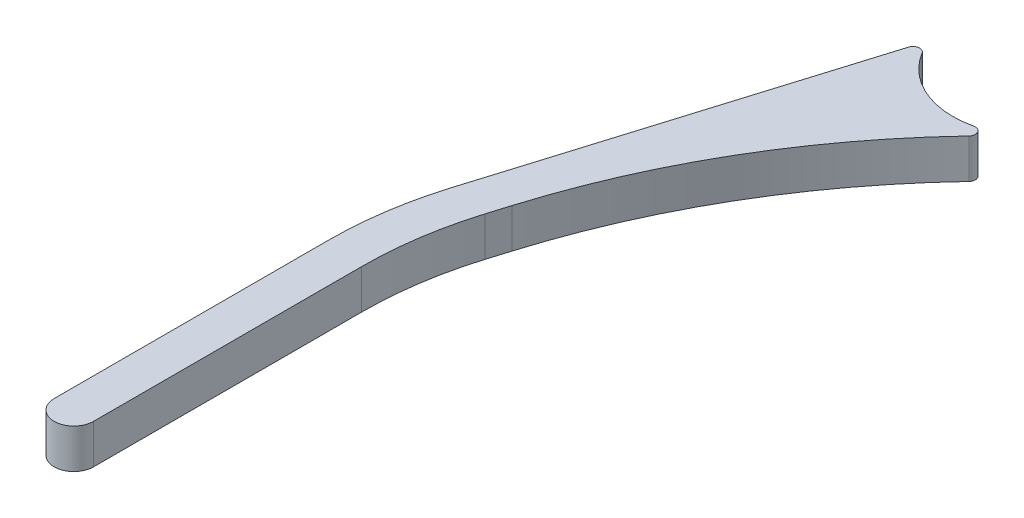
ISO-10303-21;
HEADER;
FILE_DESCRIPTION(('STEP AP214'),'2;1');
FILE_NAME('part.step','',(''),(''),'','','');
FILE_SCHEMA(('AUTOMOTIVE_DESIGN { 1 0 10303 214 1 1 1 1 }'));
ENDSEC;
DATA;
#1=APPLICATION_CONTEXT('core data for automotive mechanical design processes');
#2=APPLICATION_PROTOCOL_DEFINITION('international standard','automotive_design',2000,#1);
#3=PRODUCT_CONTEXT('',#1,'mechanical');
#4=PRODUCT('Part','Part','',(#3));
#5=PRODUCT_RELATED_PRODUCT_CATEGORY('part','',(#4));
#6=PRODUCT_DEFINITION_FORMATION('','',#4);
#7=PRODUCT_DEFINITION_CONTEXT('part definition',#1,'design');
#8=PRODUCT_DEFINITION('design','',#6,#7);
#9=PRODUCT_DEFINITION_SHAPE('','',#8);
#10=(LENGTH_UNIT() NAMED_UNIT(*) SI_UNIT(.MILLI.,.METRE.));
#11=(NAMED_UNIT(*) PLANE_ANGLE_UNIT() SI_UNIT($,.RADIAN.));
#12=(NAMED_UNIT(*) SI_UNIT($,.STERADIAN.) SOLID_ANGLE_UNIT());
#13=UNCERTAINTY_MEASURE_WITH_UNIT(LENGTH_MEASURE(1.E-05),#10,'distance_accuracy_value','');
#14=(GEOMETRIC_REPRESENTATION_CONTEXT(3) GLOBAL_UNCERTAINTY_ASSIGNED_CONTEXT((#13)) GLOBAL_UNIT_ASSIGNED_CONTEXT((#10,
#11,#12)) REPRESENTATION_CONTEXT('',''));
#15=CARTESIAN_POINT('',(0.,0.,0.));
#16=DIRECTION('',(0.,0.,1.));
#17=DIRECTION('',(1.,0.,0.));
#18=AXIS2_PLACEMENT_3D('',#15,#16,#17);
#19=CARTESIAN_POINT('',(-89.4955830872352,19.05,374.65));
#20=DIRECTION('',(0.,-1.,0.));
#21=DIRECTION('',(0.,0.,-1.));
#22=AXIS2_PLACEMENT_3D('',#19,#20,#21);
#23=CYLINDRICAL_SURFACE('',#22,9.52500000000001);
#24=CARTESIAN_POINT('',(-89.4955830872352,0.,374.65));
#25=DIRECTION('',(0.,1.,0.));
#26=DIRECTION('',(0.,0.,-1.));
#27=AXIS2_PLACEMENT_3D('',#24,#25,#26);
#28=CIRCLE('',#27,9.52500000000001);
#29=CARTESIAN_POINT('',(-99.0205830872352,0.,374.65));
#30=VERTEX_POINT('',#29);
#31=CARTESIAN_POINT('',(-79.9705830872352,0.,374.65));
#32=VERTEX_POINT('',#31);
#33=EDGE_CURVE('E149',#30,#32,#28,.T.);
#34=ORIENTED_EDGE('',*,*,#33,.T.);
#35=DIRECTION('',(0.,-1.,0.));
#36=VECTOR('',#35,1.);
#37=CARTESIAN_POINT('',(-79.9705830872352,19.05,374.65));
#38=LINE('',#37,#36);
#39=CARTESIAN_POINT('',(-79.9705830872352,19.05,374.65));
#40=VERTEX_POINT('',#39);
#41=EDGE_CURVE('E11',#40,#32,#38,.T.);
#42=ORIENTED_EDGE('',*,*,#41,.F.);
#43=CARTESIAN_POINT('',(-89.4955830872352,19.05,374.65));
#44=DIRECTION('',(0.,1.,0.));
#45=DIRECTION('',(0.,0.,-1.));
#46=AXIS2_PLACEMENT_3D('',#43,#44,#45);
#47=CIRCLE('',#46,9.52500000000001);
#48=CARTESIAN_POINT('',(-99.0205830872352,19.05,374.65));
#49=VERTEX_POINT('',#48);
#50=EDGE_CURVE('E170',#49,#40,#47,.T.);
#51=ORIENTED_EDGE('',*,*,#50,.F.);
#52=DIRECTION('',(0.,-1.,0.));
#53=VECTOR('',#52,1.);
#54=CARTESIAN_POINT('',(-99.0205830872352,19.05,374.65));
#55=LINE('',#54,#53);
#56=EDGE_CURVE('E145',#49,#30,#55,.T.);
#57=ORIENTED_EDGE('',*,*,#56,.T.);
#58=EDGE_LOOP('',(#34,#42,#51,#57));
#59=FACE_BOUND('',#58,.T.);
#60=ADVANCED_FACE('F32',(#59),#23,.T.);
#61=CARTESIAN_POINT('',(-79.9705830872352,19.05,245.266880287831));
#62=DIRECTION('',(-1.,0.,0.));
#63=DIRECTION('',(0.,0.,1.));
#64=AXIS2_PLACEMENT_3D('',#61,#62,#63);
#65=PLANE('',#64);
#66=DIRECTION('',(0.,0.,-1.));
#67=VECTOR('',#66,1.);
#68=CARTESIAN_POINT('',(-79.9705830872352,0.,245.266880287831));
#69=LINE('',#68,#67);
#70=CARTESIAN_POINT('',(-79.9705830872352,0.,245.266880287831));
#71=VERTEX_POINT('',#70);
#72=EDGE_CURVE('E152',#32,#71,#69,.T.);
#73=ORIENTED_EDGE('',*,*,#72,.T.);
#74=DIRECTION('',(0.,-1.,0.));
#75=VECTOR('',#74,1.);
#76=CARTESIAN_POINT('',(-79.9705830872352,19.05,245.266880287831));
#77=LINE('',#76,#75);
#78=CARTESIAN_POINT('',(-79.9705830872352,19.05,245.266880287831));
#79=VERTEX_POINT('',#78);
#80=EDGE_CURVE('E40',#79,#71,#77,.T.);
#81=ORIENTED_EDGE('',*,*,#80,.F.);
#82=DIRECTION('',(0.,0.,-1.));
#83=VECTOR('',#82,1.);
#84=CARTESIAN_POINT('',(-79.9705830872352,19.05,245.266880287831));
#85=LINE('',#84,#83);
#86=EDGE_CURVE('E101',#40,#79,#85,.T.);
#87=ORIENTED_EDGE('',*,*,#86,.F.);
#88=ORIENTED_EDGE('',*,*,#41,.T.);
#89=EDGE_LOOP('',(#73,#81,#87,#88));
#90=FACE_BOUND('',#89,.T.);
#91=ADVANCED_FACE('F242',(#90),#65,.F.);
#92=CARTESIAN_POINT('',(97.8294169127646,19.05,245.266880287832));
#93=DIRECTION('',(0.,-1.,0.));
#94=DIRECTION('',(0.,0.,-1.));
#95=AXIS2_PLACEMENT_3D('',#92,#93,#94);
#96=CYLINDRICAL_SURFACE('',#95,177.8);
#97=CARTESIAN_POINT('',(97.8294169127646,0.,245.266880287832));
#98=DIRECTION('',(0.,-1.,0.));
#99=DIRECTION('',(0.,0.,1.));
#100=AXIS2_PLACEMENT_3D('',#97,#98,#99);
#101=CIRCLE('',#100,177.8);
#102=CARTESIAN_POINT('',(-72.2428551354819,0.,193.418425341255));
#103=VERTEX_POINT('',#102);
#104=EDGE_CURVE('E155',#71,#103,#101,.T.);
#105=ORIENTED_EDGE('',*,*,#104,.T.);
#106=DIRECTION('',(0.,-1.,0.));
#107=VECTOR('',#106,1.);
#108=CARTESIAN_POINT('',(-72.2428551354819,19.05,193.418425341255));
#109=LINE('',#108,#107);
#110=CARTESIAN_POINT('',(-72.2428551354819,19.05,193.418425341255));
#111=VERTEX_POINT('',#110);
#112=EDGE_CURVE('E186',#111,#103,#109,.T.);
#113=ORIENTED_EDGE('',*,*,#112,.F.);
#114=CARTESIAN_POINT('',(97.8294169127646,19.05,245.266880287832));
#115=DIRECTION('',(0.,-1.,0.));
#116=DIRECTION('',(0.,0.,1.));
#117=AXIS2_PLACEMENT_3D('',#114,#115,#116);
#118=CIRCLE('',#117,177.8);
#119=EDGE_CURVE('E194',#79,#111,#118,.T.);
#120=ORIENTED_EDGE('',*,*,#119,.F.);
#121=ORIENTED_EDGE('',*,*,#80,.T.);
#122=EDGE_LOOP('',(#105,#113,#120,#121));
#123=FACE_BOUND('',#122,.T.);
#124=ADVANCED_FACE('F192',(#123),#96,.F.);
#125=CARTESIAN_POINT('',(-69.161727013274,19.05,183.311770075335));
#126=DIRECTION('',(-0.956536963150994,0.,-0.291611107686032));
#127=DIRECTION('',(-0.291611107686032,0.,0.956536963150994));
#128=AXIS2_PLACEMENT_3D('',#125,#126,#127);
#129=PLANE('',#128);
#130=DIRECTION('',(0.291611107686032,0.,-0.956536963150994));
#131=VECTOR('',#130,1.);
#132=CARTESIAN_POINT('',(-69.161727013274,0.,183.311770075335));
#133=LINE('',#132,#131);
#134=CARTESIAN_POINT('',(-69.161727013274,0.,183.311770075335));
#135=VERTEX_POINT('',#134);
#136=EDGE_CURVE('E157',#103,#135,#133,.T.);
#137=ORIENTED_EDGE('',*,*,#136,.T.);
#138=DIRECTION('',(0.,-1.,0.));
#139=VECTOR('',#138,1.);
#140=CARTESIAN_POINT('',(-69.161727013274,19.05,183.311770075335));
#141=LINE('',#140,#139);
#142=CARTESIAN_POINT('',(-69.161727013274,19.05,183.311770075335));
#143=VERTEX_POINT('',#142);
#144=EDGE_CURVE('E183',#143,#135,#141,.T.);
#145=ORIENTED_EDGE('',*,*,#144,.F.);
#146=DIRECTION('',(0.291611107686032,0.,-0.956536963150994));
#147=VECTOR('',#146,1.);
#148=CARTESIAN_POINT('',(-69.161727013274,19.05,183.311770075335));
#149=LINE('',#148,#147);
#150=EDGE_CURVE('E212',#111,#143,#149,.T.);
#151=ORIENTED_EDGE('',*,*,#150,.F.);
#152=ORIENTED_EDGE('',*,*,#112,.T.);
#153=EDGE_LOOP('',(#137,#145,#151,#152));
#154=FACE_BOUND('',#153,.T.);
#155=ADVANCED_FACE('F203',(#154),#129,.F.);
#156=CARTESIAN_POINT('',(266.906174547564,19.05,285.765869401558));
#157=DIRECTION('',(0.,-1.,0.));
#158=DIRECTION('',(0.,0.,-1.));
#159=AXIS2_PLACEMENT_3D('',#156,#157,#158);
#160=CYLINDRICAL_SURFACE('',#159,351.338123363026);
#161=CARTESIAN_POINT('',(266.906174547564,0.,285.765869401558));
#162=DIRECTION('',(0.,-1.,0.));
#163=DIRECTION('',(0.,0.,-1.));
#164=AXIS2_PLACEMENT_3D('',#161,#162,#163);
#165=CIRCLE('',#164,351.338123363026);
#166=CARTESIAN_POINT('',(12.0504296123994,0.,43.924958466714));
#167=VERTEX_POINT('',#166);
#168=EDGE_CURVE('E159',#135,#167,#165,.T.);
#169=ORIENTED_EDGE('',*,*,#168,.T.);
#170=DIRECTION('',(0.,-1.,0.));
#171=VECTOR('',#170,1.);
#172=CARTESIAN_POINT('',(12.0504296123994,19.05,43.924958466714));
#173=LINE('',#172,#171);
#174=CARTESIAN_POINT('',(12.0504296123994,19.05,43.924958466714));
#175=VERTEX_POINT('',#174);
#176=EDGE_CURVE('E180',#175,#167,#173,.T.);
#177=ORIENTED_EDGE('',*,*,#176,.F.);
#178=CARTESIAN_POINT('',(266.906174547564,19.05,285.765869401558));
#179=DIRECTION('',(0.,-1.,0.));
#180=DIRECTION('',(0.,0.,-1.));
#181=AXIS2_PLACEMENT_3D('',#178,#179,#180);
#182=CIRCLE('',#181,351.338123363026);
#183=EDGE_CURVE('E209',#143,#175,#182,.T.);
#184=ORIENTED_EDGE('',*,*,#183,.F.);
#185=ORIENTED_EDGE('',*,*,#144,.T.);
#186=EDGE_LOOP('',(#169,#177,#184,#185));
#187=FACE_BOUND('',#186,.T.);
#188=ADVANCED_FACE('F207',(#187),#160,.F.);
#189=CARTESIAN_POINT('',(9.74732916197356,19.05,41.7394714923194));
#190=DIRECTION('',(0.,-1.,0.));
#191=DIRECTION('',(0.,0.,-1.));
#192=AXIS2_PLACEMENT_3D('',#189,#190,#191);
#193=CYLINDRICAL_SURFACE('',#192,3.17499999999998);
#194=CARTESIAN_POINT('',(9.74732916197356,0.,41.7394714923194));
#195=DIRECTION('',(0.,1.,0.));
#196=DIRECTION('',(0.,0.,-1.));
#197=AXIS2_PLACEMENT_3D('',#194,#195,#196);
#198=CIRCLE('',#197,3.17499999999998);
#199=CARTESIAN_POINT('',(9.02530477960515,0.,38.6476587891846));
#200=VERTEX_POINT('',#199);
#201=EDGE_CURVE('E161',#167,#200,#198,.T.);
#202=ORIENTED_EDGE('',*,*,#201,.T.);
#203=DIRECTION('',(0.,-1.,0.));
#204=VECTOR('',#203,1.);
#205=CARTESIAN_POINT('',(9.02530477960515,19.05,38.6476587891846));
#206=LINE('',#205,#204);
#207=CARTESIAN_POINT('',(9.02530477960515,19.05,38.6476587891846));
#208=VERTEX_POINT('',#207);
#209=EDGE_CURVE('E177',#208,#200,#206,.T.);
#210=ORIENTED_EDGE('',*,*,#209,.F.);
#211=CARTESIAN_POINT('',(9.74732916197356,19.05,41.7394714923194));
#212=DIRECTION('',(0.,1.,0.));
#213=DIRECTION('',(0.,0.,-1.));
#214=AXIS2_PLACEMENT_3D('',#211,#212,#213);
#215=CIRCLE('',#214,3.17499999999998);
#216=EDGE_CURVE('E211',#175,#208,#215,.T.);
#217=ORIENTED_EDGE('',*,*,#216,.F.);
#218=ORIENTED_EDGE('',*,*,#176,.T.);
#219=EDGE_LOOP('',(#202,#210,#217,#218));
#220=FACE_BOUND('',#219,.T.);
#221=ADVANCED_FACE('F255',(#220),#193,.T.);
#222=CARTESIAN_POINT('',(0.,19.05,0.));
#223=DIRECTION('',(0.,-1.,0.));
#224=DIRECTION('',(0.,0.,-1.));
#225=AXIS2_PLACEMENT_3D('',#222,#223,#224);
#226=CYLINDRICAL_SURFACE('',#225,39.6875);
#227=CARTESIAN_POINT('',(0.,0.,0.));
#228=DIRECTION('',(0.,-1.,0.));
#229=DIRECTION('',(0.,0.,1.));
#230=AXIS2_PLACEMENT_3D('',#227,#228,#229);
#231=CIRCLE('',#230,39.6875);
#232=CARTESIAN_POINT('',(-33.934614128376,0.,20.5800782362028));
#233=VERTEX_POINT('',#232);
#234=EDGE_CURVE('E163',#200,#233,#231,.T.);
#235=ORIENTED_EDGE('',*,*,#234,.T.);
#236=DIRECTION('',(0.,-1.,0.));
#237=VECTOR('',#236,1.);
#238=CARTESIAN_POINT('',(-33.934614128376,19.05,20.5800782362028));
#239=LINE('',#238,#237);
#240=CARTESIAN_POINT('',(-33.934614128376,19.05,20.5800782362028));
#241=VERTEX_POINT('',#240);
#242=EDGE_CURVE('E174',#241,#233,#239,.T.);
#243=ORIENTED_EDGE('',*,*,#242,.F.);
#244=CARTESIAN_POINT('',(0.,19.05,0.));
#245=DIRECTION('',(0.,-1.,0.));
#246=DIRECTION('',(0.,0.,1.));
#247=AXIS2_PLACEMENT_3D('',#244,#245,#246);
#248=CIRCLE('',#247,39.6875);
#249=EDGE_CURVE('E214',#208,#241,#248,.T.);
#250=ORIENTED_EDGE('',*,*,#249,.F.);
#251=ORIENTED_EDGE('',*,*,#209,.T.);
#252=EDGE_LOOP('',(#235,#243,#250,#251));
#253=FACE_BOUND('',#252,.T.);
#254=ADVANCED_FACE('F223',(#253),#226,.F.);
#255=CARTESIAN_POINT('',(-36.649383258646,19.05,22.226484495099));
#256=DIRECTION('',(0.,-1.,0.));
#257=DIRECTION('',(0.,0.,-1.));
#258=AXIS2_PLACEMENT_3D('',#255,#256,#257);
#259=CYLINDRICAL_SURFACE('',#258,3.17499999999999);
#260=CARTESIAN_POINT('',(-36.649383258646,0.,22.226484495099));
#261=DIRECTION('',(0.,1.,0.));
#262=DIRECTION('',(0.,0.,-1.));
#263=AXIS2_PLACEMENT_3D('',#260,#261,#262);
#264=CIRCLE('',#263,3.17499999999999);
#265=CARTESIAN_POINT('',(-39.6863881166504,0.,21.3006192281958));
#266=VERTEX_POINT('',#265);
#267=EDGE_CURVE('E165',#233,#266,#264,.T.);
#268=ORIENTED_EDGE('',*,*,#267,.T.);
#269=DIRECTION('',(0.,-1.,0.));
#270=VECTOR('',#269,1.);
#271=CARTESIAN_POINT('',(-39.6863881166504,19.05,21.3006192281958));
#272=LINE('',#271,#270);
#273=CARTESIAN_POINT('',(-39.6863881166504,19.05,21.3006192281958));
#274=VERTEX_POINT('',#273);
#275=EDGE_CURVE('E140',#274,#266,#272,.T.);
#276=ORIENTED_EDGE('',*,*,#275,.F.);
#277=CARTESIAN_POINT('',(-36.649383258646,19.05,22.226484495099));
#278=DIRECTION('',(0.,1.,0.));
#279=DIRECTION('',(0.,0.,-1.));
#280=AXIS2_PLACEMENT_3D('',#277,#278,#279);
#281=CIRCLE('',#280,3.17499999999999);
#282=EDGE_CURVE('E131',#241,#274,#281,.T.);
#283=ORIENTED_EDGE('',*,*,#282,.F.);
#284=ORIENTED_EDGE('',*,*,#242,.T.);
#285=EDGE_LOOP('',(#268,#276,#283,#284));
#286=FACE_BOUND('',#285,.T.);
#287=ADVANCED_FACE('F227',(#286),#259,.T.);
#288=CARTESIAN_POINT('',(-91.292855135482,19.05,190.579127282469));
#289=DIRECTION('',(0.956536963150994,0.,0.29161110768603));
#290=DIRECTION('',(0.29161110768603,0.,-0.956536963150994));
#291=AXIS2_PLACEMENT_3D('',#288,#289,#290);
#292=PLANE('',#291);
#293=DIRECTION('',(-0.29161110768603,0.,0.956536963150994));
#294=VECTOR('',#293,1.);
#295=CARTESIAN_POINT('',(-91.292855135482,0.,190.579127282469));
#296=LINE('',#295,#294);
#297=CARTESIAN_POINT('',(-91.292855135482,0.,190.579127282469));
#298=VERTEX_POINT('',#297);
#299=EDGE_CURVE('E139',#266,#298,#296,.T.);
#300=ORIENTED_EDGE('',*,*,#299,.T.);
#301=DIRECTION('',(0.,-1.,0.));
#302=VECTOR('',#301,1.);
#303=CARTESIAN_POINT('',(-91.292855135482,19.05,190.579127282469));
#304=LINE('',#303,#302);
#305=CARTESIAN_POINT('',(-91.292855135482,19.05,190.579127282469));
#306=VERTEX_POINT('',#305);
#307=EDGE_CURVE('E136',#306,#298,#304,.T.);
#308=ORIENTED_EDGE('',*,*,#307,.F.);
#309=DIRECTION('',(-0.29161110768603,0.,0.956536963150994));
#310=VECTOR('',#309,1.);
#311=CARTESIAN_POINT('',(-91.292855135482,19.05,190.579127282469));
#312=LINE('',#311,#310);
#313=EDGE_CURVE('E125',#274,#306,#312,.T.);
#314=ORIENTED_EDGE('',*,*,#313,.F.);
#315=ORIENTED_EDGE('',*,*,#275,.T.);
#316=EDGE_LOOP('',(#300,#308,#314,#315));
#317=FACE_BOUND('',#316,.T.);
#318=ADVANCED_FACE('F137',(#317),#292,.F.);
#319=CARTESIAN_POINT('',(78.7794169127647,19.05,242.427582229045));
#320=DIRECTION('',(0.,-1.,0.));
#321=DIRECTION('',(0.,0.,-1.));
#322=AXIS2_PLACEMENT_3D('',#319,#320,#321);
#323=CYLINDRICAL_SURFACE('',#322,177.8);
#324=CARTESIAN_POINT('',(78.7794169127647,0.,242.427582229045));
#325=DIRECTION('',(0.,1.,0.));
#326=DIRECTION('',(0.,0.,1.));
#327=AXIS2_PLACEMENT_3D('',#324,#325,#326);
#328=CIRCLE('',#327,177.8);
#329=CARTESIAN_POINT('',(-99.0205830872353,0.,242.427582229045));
#330=VERTEX_POINT('',#329);
#331=EDGE_CURVE('E87',#298,#330,#328,.T.);
#332=ORIENTED_EDGE('',*,*,#331,.T.);
#333=DIRECTION('',(0.,-1.,0.));
#334=VECTOR('',#333,1.);
#335=CARTESIAN_POINT('',(-99.0205830872353,19.05,242.427582229045));
#336=LINE('',#335,#334);
#337=CARTESIAN_POINT('',(-99.0205830872353,19.05,242.427582229045));
#338=VERTEX_POINT('',#337);
#339=EDGE_CURVE('E141',#338,#330,#336,.T.);
#340=ORIENTED_EDGE('',*,*,#339,.F.);
#341=CARTESIAN_POINT('',(78.7794169127647,19.05,242.427582229045));
#342=DIRECTION('',(0.,1.,0.));
#343=DIRECTION('',(0.,0.,1.));
#344=AXIS2_PLACEMENT_3D('',#341,#342,#343);
#345=CIRCLE('',#344,177.8);
#346=EDGE_CURVE('E129',#306,#338,#345,.T.);
#347=ORIENTED_EDGE('',*,*,#346,.F.);
#348=ORIENTED_EDGE('',*,*,#307,.T.);
#349=EDGE_LOOP('',(#332,#340,#347,#348));
#350=FACE_BOUND('',#349,.T.);
#351=ADVANCED_FACE('F143',(#350),#323,.T.);
#352=CARTESIAN_POINT('',(-99.0205830872353,19.05,242.427582229045));
#353=DIRECTION('',(1.,0.,0.));
#354=DIRECTION('',(0.,0.,-1.));
#355=AXIS2_PLACEMENT_3D('',#352,#353,#354);
#356=PLANE('',#355);
#357=DIRECTION('',(0.,0.,1.));
#358=VECTOR('',#357,1.);
#359=CARTESIAN_POINT('',(-99.0205830872353,0.,242.427582229045));
#360=LINE('',#359,#358);
#361=EDGE_CURVE('E93',#330,#30,#360,.T.);
#362=ORIENTED_EDGE('',*,*,#361,.T.);
#363=ORIENTED_EDGE('',*,*,#56,.F.);
#364=DIRECTION('',(0.,0.,1.));
#365=VECTOR('',#364,1.);
#366=CARTESIAN_POINT('',(-99.0205830872353,19.05,242.427582229045));
#367=LINE('',#366,#365);
#368=EDGE_CURVE('E48',#338,#49,#367,.T.);
#369=ORIENTED_EDGE('',*,*,#368,.F.);
#370=ORIENTED_EDGE('',*,*,#339,.T.);
#371=EDGE_LOOP('',(#362,#363,#369,#370));
#372=FACE_BOUND('',#371,.T.);
#373=ADVANCED_FACE('F231',(#372),#356,.F.);
#374=CARTESIAN_POINT('',(-89.4955830872352,19.05,374.65));
#375=DIRECTION('',(0.,-1.,0.));
#376=DIRECTION('',(0.,0.,-1.));
#377=AXIS2_PLACEMENT_3D('',#374,#375,#376);
#378=PLANE('',#377);
#379=ORIENTED_EDGE('',*,*,#50,.T.);
#380=ORIENTED_EDGE('',*,*,#86,.T.);
#381=ORIENTED_EDGE('',*,*,#119,.T.);
#382=ORIENTED_EDGE('',*,*,#150,.T.);
#383=ORIENTED_EDGE('',*,*,#183,.T.);
#384=ORIENTED_EDGE('',*,*,#216,.T.);
#385=ORIENTED_EDGE('',*,*,#249,.T.);
#386=ORIENTED_EDGE('',*,*,#282,.T.);
#387=ORIENTED_EDGE('',*,*,#313,.T.);
#388=ORIENTED_EDGE('',*,*,#346,.T.);
#389=ORIENTED_EDGE('',*,*,#368,.T.);
#390=EDGE_LOOP('',(#379,#380,#381,#382,#383,#384,#385,#386,#387,#388,#389));
#391=FACE_BOUND('',#390,.T.);
#392=ADVANCED_FACE('F127',(#391),#378,.F.);
#393=CARTESIAN_POINT('',(-89.4955830872352,0.,374.65));
#394=DIRECTION('',(0.,-1.,0.));
#395=DIRECTION('',(0.,0.,-1.));
#396=AXIS2_PLACEMENT_3D('',#393,#394,#395);
#397=PLANE('',#396);
#398=CARTESIAN_POINT('',(-89.4955830872352,0.,358.775));
#399=DIRECTION('',(0.,-1.,0.));
#400=DIRECTION('',(0.,0.,-1.));
#401=AXIS2_PLACEMENT_3D('',#398,#399,#400);
#402=CIRCLE('',#401,1.58749999999999);
#403=CARTESIAN_POINT('',(-89.4955830872352,0.,357.1875));
#404=VERTEX_POINT('',#403);
#405=EDGE_CURVE('E358',#404,#404,#402,.T.);
#406=ORIENTED_EDGE('',*,*,#405,.F.);
#407=EDGE_LOOP('',(#406));
#408=FACE_BOUND('',#407,.T.);
#409=CARTESIAN_POINT('',(-31.1925791339663,0.,50.114011233342));
#410=DIRECTION('',(0.,-1.,0.));
#411=DIRECTION('',(0.,0.,-1.));
#412=AXIS2_PLACEMENT_3D('',#409,#410,#411);
#413=CIRCLE('',#412,1.58749999999999);
#414=CARTESIAN_POINT('',(-31.1925791339663,0.,48.526511233342));
#415=VERTEX_POINT('',#414);
#416=EDGE_CURVE('E360',#415,#415,#413,.T.);
#417=ORIENTED_EDGE('',*,*,#416,.F.);
#418=EDGE_LOOP('',(#417));
#419=FACE_BOUND('',#418,.T.);
#420=CARTESIAN_POINT('',(-87.5530395259349,0.,217.636641510955));
#421=DIRECTION('',(0.,-1.,0.));
#422=DIRECTION('',(0.,0.,-1.));
#423=AXIS2_PLACEMENT_3D('',#420,#421,#422);
#424=CIRCLE('',#423,1.58749999999999);
#425=CARTESIAN_POINT('',(-87.5530395259349,0.,216.049141510955));
#426=VERTEX_POINT('',#425);
#427=EDGE_CURVE('E368',#426,#426,#424,.T.);
#428=ORIENTED_EDGE('',*,*,#427,.F.);
#429=EDGE_LOOP('',(#428));
#430=FACE_BOUND('',#429,.T.);
#431=ORIENTED_EDGE('',*,*,#33,.F.);
#432=ORIENTED_EDGE('',*,*,#361,.F.);
#433=ORIENTED_EDGE('',*,*,#331,.F.);
#434=ORIENTED_EDGE('',*,*,#299,.F.);
#435=ORIENTED_EDGE('',*,*,#267,.F.);
#436=ORIENTED_EDGE('',*,*,#234,.F.);
#437=ORIENTED_EDGE('',*,*,#201,.F.);
#438=ORIENTED_EDGE('',*,*,#168,.F.);
#439=ORIENTED_EDGE('',*,*,#136,.F.);
#440=ORIENTED_EDGE('',*,*,#104,.F.);
#441=ORIENTED_EDGE('',*,*,#72,.F.);
#442=EDGE_LOOP('',(#431,#432,#433,#434,#435,#436,#437,#438,#439,#440,#441));
#443=FACE_BOUND('',#442,.T.);
#444=ADVANCED_FACE('F198',(#408,#419,#430,#443),#397,.T.);
#445=CARTESIAN_POINT('',(-87.5530395259349,11.1252,217.636641510955));
#446=DIRECTION('',(0.,-1.,0.));
#447=DIRECTION('',(0.,0.,-1.));
#448=AXIS2_PLACEMENT_3D('',#445,#446,#447);
#449=CONICAL_SURFACE('',#448,1.58749999999999,1.02974425867665);
#450=CARTESIAN_POINT('',(-87.5530395259349,12.0790662327063,217.636641510955));
#451=VERTEX_POINT('',#450);
#452=VERTEX_LOOP('',#451);
#453=FACE_BOUND('',#452,.T.);
#454=CARTESIAN_POINT('',(-87.5530395259349,11.1252,217.636641510955));
#455=DIRECTION('',(0.,-1.,0.));
#456=DIRECTION('',(0.,0.,-1.));
#457=AXIS2_PLACEMENT_3D('',#454,#455,#456);
#458=CIRCLE('',#457,1.58749999999999);
#459=CARTESIAN_POINT('',(-87.5530395259349,11.1252,216.049141510955));
#460=VERTEX_POINT('',#459);
#461=EDGE_CURVE('E153',#460,#460,#458,.T.);
#462=ORIENTED_EDGE('',*,*,#461,.T.);
#463=EDGE_LOOP('',(#462));
#464=FACE_BOUND('',#463,.T.);
#465=ADVANCED_FACE('F291',(#453,#464),#449,.F.);
#466=CARTESIAN_POINT('',(-87.5530395259349,0.,217.636641510955));
#467=DIRECTION('',(0.,-1.,0.));
#468=DIRECTION('',(0.,0.,-1.));
#469=AXIS2_PLACEMENT_3D('',#466,#467,#468);
#470=CYLINDRICAL_SURFACE('',#469,1.58749999999999);
#471=ORIENTED_EDGE('',*,*,#461,.F.);
#472=EDGE_LOOP('',(#471));
#473=FACE_BOUND('',#472,.T.);
#474=ORIENTED_EDGE('',*,*,#427,.T.);
#475=EDGE_LOOP('',(#474));
#476=FACE_BOUND('',#475,.T.);
#477=ADVANCED_FACE('F298',(#473,#476),#470,.F.);
#478=CARTESIAN_POINT('',(-31.1925791339663,11.1252,50.114011233342));
#479=DIRECTION('',(0.,-1.,0.));
#480=DIRECTION('',(0.,0.,-1.));
#481=AXIS2_PLACEMENT_3D('',#478,#479,#480);
#482=CONICAL_SURFACE('',#481,1.58749999999999,1.02974425867665);
#483=CARTESIAN_POINT('',(-31.1925791339663,12.0790662327063,50.114011233342));
#484=VERTEX_POINT('',#483);
#485=VERTEX_LOOP('',#484);
#486=FACE_BOUND('',#485,.T.);
#487=CARTESIAN_POINT('',(-31.1925791339663,11.1252,50.114011233342));
#488=DIRECTION('',(0.,-1.,0.));
#489=DIRECTION('',(0.,0.,-1.));
#490=AXIS2_PLACEMENT_3D('',#487,#488,#489);
#491=CIRCLE('',#490,1.58749999999999);
#492=CARTESIAN_POINT('',(-31.1925791339663,11.1252,48.526511233342));
#493=VERTEX_POINT('',#492);
#494=EDGE_CURVE('E365',#493,#493,#491,.T.);
#495=ORIENTED_EDGE('',*,*,#494,.T.);
#496=EDGE_LOOP('',(#495));
#497=FACE_BOUND('',#496,.T.);
#498=ADVANCED_FACE('F308',(#486,#497),#482,.F.);
#499=CARTESIAN_POINT('',(-31.1925791339663,0.,50.114011233342));
#500=DIRECTION('',(0.,-1.,0.));
#501=DIRECTION('',(0.,0.,-1.));
#502=AXIS2_PLACEMENT_3D('',#499,#500,#501);
#503=CYLINDRICAL_SURFACE('',#502,1.58749999999999);
#504=ORIENTED_EDGE('',*,*,#494,.F.);
#505=EDGE_LOOP('',(#504));
#506=FACE_BOUND('',#505,.T.);
#507=ORIENTED_EDGE('',*,*,#416,.T.);
#508=EDGE_LOOP('',(#507));
#509=FACE_BOUND('',#508,.T.);
#510=ADVANCED_FACE('F318',(#506,#509),#503,.F.);
#511=CARTESIAN_POINT('',(-89.4955830872352,11.1252,358.775));
#512=DIRECTION('',(0.,-1.,0.));
#513=DIRECTION('',(0.,0.,-1.));
#514=AXIS2_PLACEMENT_3D('',#511,#512,#513);
#515=CONICAL_SURFACE('',#514,1.58749999999999,1.02974425867665);
#516=CARTESIAN_POINT('',(-89.4955830872352,12.0790662327063,358.775));
#517=VERTEX_POINT('',#516);
#518=VERTEX_LOOP('',#517);
#519=FACE_BOUND('',#518,.T.);
#520=CARTESIAN_POINT('',(-89.4955830872352,11.1252,358.775));
#521=DIRECTION('',(0.,-1.,0.));
#522=DIRECTION('',(0.,0.,-1.));
#523=AXIS2_PLACEMENT_3D('',#520,#521,#522);
#524=CIRCLE('',#523,1.58749999999999);
#525=CARTESIAN_POINT('',(-89.4955830872352,11.1252,357.1875));
#526=VERTEX_POINT('',#525);
#527=EDGE_CURVE('E355',#526,#526,#524,.T.);
#528=ORIENTED_EDGE('',*,*,#527,.T.);
#529=EDGE_LOOP('',(#528));
#530=FACE_BOUND('',#529,.T.);
#531=ADVANCED_FACE('F328',(#519,#530),#515,.F.);
#532=CARTESIAN_POINT('',(-89.4955830872352,0.,358.775));
#533=DIRECTION('',(0.,-1.,0.));
#534=DIRECTION('',(0.,0.,-1.));
#535=AXIS2_PLACEMENT_3D('',#532,#533,#534);
#536=CYLINDRICAL_SURFACE('',#535,1.58749999999999);
#537=ORIENTED_EDGE('',*,*,#527,.F.);
#538=EDGE_LOOP('',(#537));
#539=FACE_BOUND('',#538,.T.);
#540=ORIENTED_EDGE('',*,*,#405,.T.);
#541=EDGE_LOOP('',(#540));
#542=FACE_BOUND('',#541,.T.);
#543=ADVANCED_FACE('F338',(#539,#542),#536,.F.);
#544=CLOSED_SHELL('',(#60,#91,#124,#155,#188,#221,#254,#287,#318,#351,#373,#392,#444,#465,#477,
#498,#510,#531,#543));
#545=MANIFOLD_SOLID_BREP('B2',#544);
#546=ADVANCED_BREP_SHAPE_REPRESENTATION('',(#18,#545),#14);
#547=SHAPE_DEFINITION_REPRESENTATION(#9,#546);
ENDSEC;
END-ISO-10303-21;
